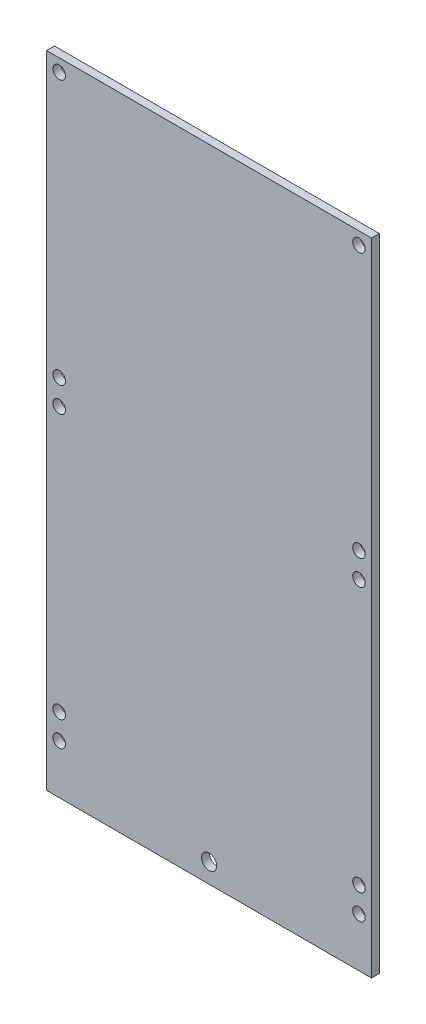
ISO-10303-21;
HEADER;
FILE_DESCRIPTION(('STEP AP214'),'2;1');
FILE_NAME('part.step','',(''),(''),'','','');
FILE_SCHEMA(('AUTOMOTIVE_DESIGN { 1 0 10303 214 1 1 1 1 }'));
ENDSEC;
DATA;
#1=APPLICATION_CONTEXT('core data for automotive mechanical design processes');
#2=APPLICATION_PROTOCOL_DEFINITION('international standard','automotive_design',2000,#1);
#3=PRODUCT_CONTEXT('',#1,'mechanical');
#4=PRODUCT('Part','Part','',(#3));
#5=PRODUCT_RELATED_PRODUCT_CATEGORY('part','',(#4));
#6=PRODUCT_DEFINITION_FORMATION('','',#4);
#7=PRODUCT_DEFINITION_CONTEXT('part definition',#1,'design');
#8=PRODUCT_DEFINITION('design','',#6,#7);
#9=PRODUCT_DEFINITION_SHAPE('','',#8);
#10=(LENGTH_UNIT() NAMED_UNIT(*) SI_UNIT(.MILLI.,.METRE.));
#11=(NAMED_UNIT(*) PLANE_ANGLE_UNIT() SI_UNIT($,.RADIAN.));
#12=(NAMED_UNIT(*) SI_UNIT($,.STERADIAN.) SOLID_ANGLE_UNIT());
#13=UNCERTAINTY_MEASURE_WITH_UNIT(LENGTH_MEASURE(1.E-05),#10,'distance_accuracy_value','');
#14=(GEOMETRIC_REPRESENTATION_CONTEXT(3) GLOBAL_UNCERTAINTY_ASSIGNED_CONTEXT((#13)) GLOBAL_UNIT_ASSIGNED_CONTEXT((#10,
#11,#12)) REPRESENTATION_CONTEXT('',''));
#15=CARTESIAN_POINT('',(0.,0.,0.));
#16=DIRECTION('',(0.,0.,1.));
#17=DIRECTION('',(1.,0.,0.));
#18=AXIS2_PLACEMENT_3D('',#15,#16,#17);
#19=CARTESIAN_POINT('',(0.,0.,2.));
#20=DIRECTION('',(1.,0.,0.));
#21=DIRECTION('',(0.,0.,-1.));
#22=AXIS2_PLACEMENT_3D('',#19,#20,#21);
#23=PLANE('',#22);
#24=DIRECTION('',(0.,-1.,0.));
#25=VECTOR('',#24,1.);
#26=CARTESIAN_POINT('',(0.,0.,2.));
#27=LINE('',#26,#25);
#28=CARTESIAN_POINT('',(0.,163.75,2.));
#29=VERTEX_POINT('',#28);
#30=CARTESIAN_POINT('',(0.,0.,2.));
#31=VERTEX_POINT('',#30);
#32=EDGE_CURVE('E87',#29,#31,#27,.T.);
#33=ORIENTED_EDGE('',*,*,#32,.F.);
#34=DIRECTION('',(0.,0.,-1.));
#35=VECTOR('',#34,1.);
#36=CARTESIAN_POINT('',(0.,163.75,2.));
#37=LINE('',#36,#35);
#38=CARTESIAN_POINT('',(0.,163.75,0.));
#39=VERTEX_POINT('',#38);
#40=EDGE_CURVE('E158',#29,#39,#37,.T.);
#41=ORIENTED_EDGE('',*,*,#40,.T.);
#42=DIRECTION('',(0.,-1.,0.));
#43=VECTOR('',#42,1.);
#44=CARTESIAN_POINT('',(0.,0.,0.));
#45=LINE('',#44,#43);
#46=CARTESIAN_POINT('',(0.,0.,0.));
#47=VERTEX_POINT('',#46);
#48=EDGE_CURVE('E78',#39,#47,#45,.T.);
#49=ORIENTED_EDGE('',*,*,#48,.T.);
#50=DIRECTION('',(0.,0.,-1.));
#51=VECTOR('',#50,1.);
#52=CARTESIAN_POINT('',(0.,0.,2.));
#53=LINE('',#52,#51);
#54=EDGE_CURVE('E40',#31,#47,#53,.T.);
#55=ORIENTED_EDGE('',*,*,#54,.F.);
#56=EDGE_LOOP('',(#33,#41,#49,#55));
#57=FACE_BOUND('',#56,.T.);
#58=ADVANCED_FACE('F33',(#57),#23,.F.);
#59=CARTESIAN_POINT('',(0.,0.,2.));
#60=DIRECTION('',(0.,1.,0.));
#61=DIRECTION('',(0.,0.,1.));
#62=AXIS2_PLACEMENT_3D('',#59,#60,#61);
#63=PLANE('',#62);
#64=DIRECTION('',(1.,0.,0.));
#65=VECTOR('',#64,1.);
#66=CARTESIAN_POINT('',(0.,0.,0.));
#67=LINE('',#66,#65);
#68=CARTESIAN_POINT('',(83.,0.,0.));
#69=VERTEX_POINT('',#68);
#70=EDGE_CURVE('E68',#47,#69,#67,.T.);
#71=ORIENTED_EDGE('',*,*,#70,.T.);
#72=DIRECTION('',(0.,0.,-1.));
#73=VECTOR('',#72,1.);
#74=CARTESIAN_POINT('',(83.,0.,2.));
#75=LINE('',#74,#73);
#76=CARTESIAN_POINT('',(83.,0.,2.));
#77=VERTEX_POINT('',#76);
#78=EDGE_CURVE('E71',#77,#69,#75,.T.);
#79=ORIENTED_EDGE('',*,*,#78,.F.);
#80=DIRECTION('',(1.,0.,0.));
#81=VECTOR('',#80,1.);
#82=CARTESIAN_POINT('',(0.,0.,2.));
#83=LINE('',#82,#81);
#84=EDGE_CURVE('E55',#31,#77,#83,.T.);
#85=ORIENTED_EDGE('',*,*,#84,.F.);
#86=ORIENTED_EDGE('',*,*,#54,.T.);
#87=EDGE_LOOP('',(#71,#79,#85,#86));
#88=FACE_BOUND('',#87,.T.);
#89=ADVANCED_FACE('F70',(#88),#63,.F.);
#90=CARTESIAN_POINT('',(83.,0.,2.));
#91=DIRECTION('',(-1.,0.,0.));
#92=DIRECTION('',(0.,0.,1.));
#93=AXIS2_PLACEMENT_3D('',#90,#91,#92);
#94=PLANE('',#93);
#95=DIRECTION('',(0.,1.,0.));
#96=VECTOR('',#95,1.);
#97=CARTESIAN_POINT('',(83.,0.,0.));
#98=LINE('',#97,#96);
#99=CARTESIAN_POINT('',(83.,163.75,0.));
#100=VERTEX_POINT('',#99);
#101=EDGE_CURVE('E77',#69,#100,#98,.T.);
#102=ORIENTED_EDGE('',*,*,#101,.T.);
#103=DIRECTION('',(0.,0.,1.));
#104=VECTOR('',#103,1.);
#105=CARTESIAN_POINT('',(83.,163.75,-8.));
#106=LINE('',#105,#104);
#107=CARTESIAN_POINT('',(83.,163.75,2.));
#108=VERTEX_POINT('',#107);
#109=EDGE_CURVE('E46',#100,#108,#106,.T.);
#110=ORIENTED_EDGE('',*,*,#109,.T.);
#111=DIRECTION('',(0.,1.,0.));
#112=VECTOR('',#111,1.);
#113=CARTESIAN_POINT('',(83.,0.,2.));
#114=LINE('',#113,#112);
#115=EDGE_CURVE('E83',#77,#108,#114,.T.);
#116=ORIENTED_EDGE('',*,*,#115,.F.);
#117=ORIENTED_EDGE('',*,*,#78,.T.);
#118=EDGE_LOOP('',(#102,#110,#116,#117));
#119=FACE_BOUND('',#118,.T.);
#120=ADVANCED_FACE('F82',(#119),#94,.F.);
#121=CARTESIAN_POINT('',(0.,0.,2.));
#122=DIRECTION('',(0.,0.,-1.));
#123=DIRECTION('',(-1.,0.,0.));
#124=AXIS2_PLACEMENT_3D('',#121,#122,#123);
#125=PLANE('',#124);
#126=CARTESIAN_POINT('',(41.5,4.97599999999998,2.));
#127=DIRECTION('',(0.,0.,1.));
#128=DIRECTION('',(1.,0.,0.));
#129=AXIS2_PLACEMENT_3D('',#126,#127,#128);
#130=CIRCLE('',#129,1.93);
#131=CARTESIAN_POINT('',(43.43,4.97599999999998,2.));
#132=VERTEX_POINT('',#131);
#133=EDGE_CURVE('E155',#132,#132,#130,.T.);
#134=ORIENTED_EDGE('',*,*,#133,.F.);
#135=EDGE_LOOP('',(#134));
#136=FACE_BOUND('',#135,.T.);
#137=CARTESIAN_POINT('',(79.8000000000031,12.5999999999999,2.));
#138=DIRECTION('',(0.,0.,1.));
#139=DIRECTION('',(1.,0.,0.));
#140=AXIS2_PLACEMENT_3D('',#137,#138,#139);
#141=CIRCLE('',#140,1.6);
#142=CARTESIAN_POINT('',(81.4000000000031,12.5999999999999,2.));
#143=VERTEX_POINT('',#142);
#144=EDGE_CURVE('E149',#143,#143,#141,.T.);
#145=ORIENTED_EDGE('',*,*,#144,.F.);
#146=EDGE_LOOP('',(#145));
#147=FACE_BOUND('',#146,.T.);
#148=CARTESIAN_POINT('',(79.8000000000031,19.,2.));
#149=DIRECTION('',(0.,0.,1.));
#150=DIRECTION('',(1.,0.,0.));
#151=AXIS2_PLACEMENT_3D('',#148,#149,#150);
#152=CIRCLE('',#151,1.6);
#153=CARTESIAN_POINT('',(81.4000000000031,19.,2.));
#154=VERTEX_POINT('',#153);
#155=EDGE_CURVE('E143',#154,#154,#152,.T.);
#156=ORIENTED_EDGE('',*,*,#155,.F.);
#157=EDGE_LOOP('',(#156));
#158=FACE_BOUND('',#157,.T.);
#159=CARTESIAN_POINT('',(3.2000000000031,12.5999999999999,2.));
#160=DIRECTION('',(0.,0.,1.));
#161=DIRECTION('',(1.,0.,0.));
#162=AXIS2_PLACEMENT_3D('',#159,#160,#161);
#163=CIRCLE('',#162,1.59999999999999);
#164=CARTESIAN_POINT('',(4.80000000000309,12.5999999999999,2.));
#165=VERTEX_POINT('',#164);
#166=EDGE_CURVE('E137',#165,#165,#163,.T.);
#167=ORIENTED_EDGE('',*,*,#166,.F.);
#168=EDGE_LOOP('',(#167));
#169=FACE_BOUND('',#168,.T.);
#170=CARTESIAN_POINT('',(3.2000000000031,19.,2.));
#171=DIRECTION('',(0.,0.,1.));
#172=DIRECTION('',(1.,0.,0.));
#173=AXIS2_PLACEMENT_3D('',#170,#171,#172);
#174=CIRCLE('',#173,1.59999999999999);
#175=CARTESIAN_POINT('',(4.80000000000309,19.,2.));
#176=VERTEX_POINT('',#175);
#177=EDGE_CURVE('E131',#176,#176,#174,.T.);
#178=ORIENTED_EDGE('',*,*,#177,.F.);
#179=EDGE_LOOP('',(#178));
#180=FACE_BOUND('',#179,.T.);
#181=CARTESIAN_POINT('',(79.8000000000023,86.575,2.));
#182=DIRECTION('',(0.,0.,1.));
#183=DIRECTION('',(1.,0.,0.));
#184=AXIS2_PLACEMENT_3D('',#181,#182,#183);
#185=CIRCLE('',#184,1.6);
#186=CARTESIAN_POINT('',(81.4000000000023,86.575,2.));
#187=VERTEX_POINT('',#186);
#188=EDGE_CURVE('E125',#187,#187,#185,.T.);
#189=ORIENTED_EDGE('',*,*,#188,.F.);
#190=EDGE_LOOP('',(#189));
#191=FACE_BOUND('',#190,.T.);
#192=CARTESIAN_POINT('',(79.8000000000023,92.975,2.));
#193=DIRECTION('',(0.,0.,1.));
#194=DIRECTION('',(1.,0.,0.));
#195=AXIS2_PLACEMENT_3D('',#192,#193,#194);
#196=CIRCLE('',#195,1.6);
#197=CARTESIAN_POINT('',(81.4000000000023,92.975,2.));
#198=VERTEX_POINT('',#197);
#199=EDGE_CURVE('E119',#198,#198,#196,.T.);
#200=ORIENTED_EDGE('',*,*,#199,.F.);
#201=EDGE_LOOP('',(#200));
#202=FACE_BOUND('',#201,.T.);
#203=CARTESIAN_POINT('',(3.20000000000232,86.575,2.));
#204=DIRECTION('',(0.,0.,1.));
#205=DIRECTION('',(1.,0.,0.));
#206=AXIS2_PLACEMENT_3D('',#203,#204,#205);
#207=CIRCLE('',#206,1.59999999999999);
#208=CARTESIAN_POINT('',(4.80000000000232,86.575,2.));
#209=VERTEX_POINT('',#208);
#210=EDGE_CURVE('E113',#209,#209,#207,.T.);
#211=ORIENTED_EDGE('',*,*,#210,.F.);
#212=EDGE_LOOP('',(#211));
#213=FACE_BOUND('',#212,.T.);
#214=CARTESIAN_POINT('',(3.20000000000232,92.975,2.));
#215=DIRECTION('',(0.,0.,1.));
#216=DIRECTION('',(1.,0.,0.));
#217=AXIS2_PLACEMENT_3D('',#214,#215,#216);
#218=CIRCLE('',#217,1.59999999999999);
#219=CARTESIAN_POINT('',(4.80000000000232,92.975,2.));
#220=VERTEX_POINT('',#219);
#221=EDGE_CURVE('E107',#220,#220,#218,.T.);
#222=ORIENTED_EDGE('',*,*,#221,.F.);
#223=EDGE_LOOP('',(#222));
#224=FACE_BOUND('',#223,.T.);
#225=CARTESIAN_POINT('',(79.8000000000015,160.55,2.));
#226=DIRECTION('',(0.,0.,1.));
#227=DIRECTION('',(1.,0.,0.));
#228=AXIS2_PLACEMENT_3D('',#225,#226,#227);
#229=CIRCLE('',#228,1.6);
#230=CARTESIAN_POINT('',(81.4000000000015,160.55,2.));
#231=VERTEX_POINT('',#230);
#232=EDGE_CURVE('E101',#231,#231,#229,.T.);
#233=ORIENTED_EDGE('',*,*,#232,.F.);
#234=EDGE_LOOP('',(#233));
#235=FACE_BOUND('',#234,.T.);
#236=CARTESIAN_POINT('',(3.20000000000155,160.55,2.));
#237=DIRECTION('',(0.,0.,1.));
#238=DIRECTION('',(1.,0.,0.));
#239=AXIS2_PLACEMENT_3D('',#236,#237,#238);
#240=CIRCLE('',#239,1.59999999999999);
#241=CARTESIAN_POINT('',(4.80000000000154,160.55,2.));
#242=VERTEX_POINT('',#241);
#243=EDGE_CURVE('E95',#242,#242,#240,.T.);
#244=ORIENTED_EDGE('',*,*,#243,.F.);
#245=EDGE_LOOP('',(#244));
#246=FACE_BOUND('',#245,.T.);
#247=ORIENTED_EDGE('',*,*,#115,.T.);
#248=DIRECTION('',(1.,0.,0.));
#249=VECTOR('',#248,1.);
#250=CARTESIAN_POINT('',(-33.4076517871154,163.75,2.));
#251=LINE('',#250,#249);
#252=EDGE_CURVE('E164',#29,#108,#251,.T.);
#253=ORIENTED_EDGE('',*,*,#252,.F.);
#254=ORIENTED_EDGE('',*,*,#32,.T.);
#255=ORIENTED_EDGE('',*,*,#84,.T.);
#256=EDGE_LOOP('',(#247,#253,#254,#255));
#257=FACE_BOUND('',#256,.T.);
#258=ADVANCED_FACE('F172',(#136,#147,#158,#169,#180,#191,#202,#213,#224,#235,#246,#257),#125,.F.);
#259=CARTESIAN_POINT('',(0.,0.,0.));
#260=DIRECTION('',(0.,0.,-1.));
#261=DIRECTION('',(-1.,0.,0.));
#262=AXIS2_PLACEMENT_3D('',#259,#260,#261);
#263=PLANE('',#262);
#264=DIRECTION('',(-1.,0.,0.));
#265=VECTOR('',#264,1.);
#266=CARTESIAN_POINT('',(0.,163.75,0.));
#267=LINE('',#266,#265);
#268=EDGE_CURVE('E11',#100,#39,#267,.T.);
#269=ORIENTED_EDGE('',*,*,#268,.F.);
#270=ORIENTED_EDGE('',*,*,#101,.F.);
#271=ORIENTED_EDGE('',*,*,#70,.F.);
#272=ORIENTED_EDGE('',*,*,#48,.F.);
#273=EDGE_LOOP('',(#269,#270,#271,#272));
#274=FACE_BOUND('',#273,.T.);
#275=CARTESIAN_POINT('',(41.5,4.97599999999998,0.));
#276=DIRECTION('',(0.,0.,1.));
#277=DIRECTION('',(1.,0.,0.));
#278=AXIS2_PLACEMENT_3D('',#275,#276,#277);
#279=CIRCLE('',#278,1.93);
#280=CARTESIAN_POINT('',(43.43,4.97599999999998,0.));
#281=VERTEX_POINT('',#280);
#282=EDGE_CURVE('E152',#281,#281,#279,.T.);
#283=ORIENTED_EDGE('',*,*,#282,.T.);
#284=EDGE_LOOP('',(#283));
#285=FACE_BOUND('',#284,.T.);
#286=CARTESIAN_POINT('',(79.8000000000031,12.5999999999999,0.));
#287=DIRECTION('',(0.,0.,1.));
#288=DIRECTION('',(1.,0.,0.));
#289=AXIS2_PLACEMENT_3D('',#286,#287,#288);
#290=CIRCLE('',#289,1.6);
#291=CARTESIAN_POINT('',(81.4000000000031,12.5999999999999,0.));
#292=VERTEX_POINT('',#291);
#293=EDGE_CURVE('E146',#292,#292,#290,.T.);
#294=ORIENTED_EDGE('',*,*,#293,.T.);
#295=EDGE_LOOP('',(#294));
#296=FACE_BOUND('',#295,.T.);
#297=CARTESIAN_POINT('',(79.8000000000031,19.,0.));
#298=DIRECTION('',(0.,0.,1.));
#299=DIRECTION('',(1.,0.,0.));
#300=AXIS2_PLACEMENT_3D('',#297,#298,#299);
#301=CIRCLE('',#300,1.6);
#302=CARTESIAN_POINT('',(81.4000000000031,19.,0.));
#303=VERTEX_POINT('',#302);
#304=EDGE_CURVE('E140',#303,#303,#301,.T.);
#305=ORIENTED_EDGE('',*,*,#304,.T.);
#306=EDGE_LOOP('',(#305));
#307=FACE_BOUND('',#306,.T.);
#308=CARTESIAN_POINT('',(3.2000000000031,12.5999999999999,0.));
#309=DIRECTION('',(0.,0.,1.));
#310=DIRECTION('',(1.,0.,0.));
#311=AXIS2_PLACEMENT_3D('',#308,#309,#310);
#312=CIRCLE('',#311,1.59999999999999);
#313=CARTESIAN_POINT('',(4.80000000000309,12.5999999999999,0.));
#314=VERTEX_POINT('',#313);
#315=EDGE_CURVE('E134',#314,#314,#312,.T.);
#316=ORIENTED_EDGE('',*,*,#315,.T.);
#317=EDGE_LOOP('',(#316));
#318=FACE_BOUND('',#317,.T.);
#319=CARTESIAN_POINT('',(3.2000000000031,19.,0.));
#320=DIRECTION('',(0.,0.,1.));
#321=DIRECTION('',(1.,0.,0.));
#322=AXIS2_PLACEMENT_3D('',#319,#320,#321);
#323=CIRCLE('',#322,1.59999999999999);
#324=CARTESIAN_POINT('',(4.80000000000309,19.,0.));
#325=VERTEX_POINT('',#324);
#326=EDGE_CURVE('E128',#325,#325,#323,.T.);
#327=ORIENTED_EDGE('',*,*,#326,.T.);
#328=EDGE_LOOP('',(#327));
#329=FACE_BOUND('',#328,.T.);
#330=CARTESIAN_POINT('',(79.8000000000023,86.575,0.));
#331=DIRECTION('',(0.,0.,1.));
#332=DIRECTION('',(1.,0.,0.));
#333=AXIS2_PLACEMENT_3D('',#330,#331,#332);
#334=CIRCLE('',#333,1.6);
#335=CARTESIAN_POINT('',(81.4000000000023,86.575,0.));
#336=VERTEX_POINT('',#335);
#337=EDGE_CURVE('E122',#336,#336,#334,.T.);
#338=ORIENTED_EDGE('',*,*,#337,.T.);
#339=EDGE_LOOP('',(#338));
#340=FACE_BOUND('',#339,.T.);
#341=CARTESIAN_POINT('',(79.8000000000023,92.975,0.));
#342=DIRECTION('',(0.,0.,1.));
#343=DIRECTION('',(1.,0.,0.));
#344=AXIS2_PLACEMENT_3D('',#341,#342,#343);
#345=CIRCLE('',#344,1.6);
#346=CARTESIAN_POINT('',(81.4000000000023,92.975,0.));
#347=VERTEX_POINT('',#346);
#348=EDGE_CURVE('E116',#347,#347,#345,.T.);
#349=ORIENTED_EDGE('',*,*,#348,.T.);
#350=EDGE_LOOP('',(#349));
#351=FACE_BOUND('',#350,.T.);
#352=CARTESIAN_POINT('',(3.20000000000232,86.575,0.));
#353=DIRECTION('',(0.,0.,1.));
#354=DIRECTION('',(1.,0.,0.));
#355=AXIS2_PLACEMENT_3D('',#352,#353,#354);
#356=CIRCLE('',#355,1.59999999999999);
#357=CARTESIAN_POINT('',(4.80000000000232,86.575,0.));
#358=VERTEX_POINT('',#357);
#359=EDGE_CURVE('E110',#358,#358,#356,.T.);
#360=ORIENTED_EDGE('',*,*,#359,.T.);
#361=EDGE_LOOP('',(#360));
#362=FACE_BOUND('',#361,.T.);
#363=CARTESIAN_POINT('',(3.20000000000232,92.975,0.));
#364=DIRECTION('',(0.,0.,1.));
#365=DIRECTION('',(1.,0.,0.));
#366=AXIS2_PLACEMENT_3D('',#363,#364,#365);
#367=CIRCLE('',#366,1.59999999999999);
#368=CARTESIAN_POINT('',(4.80000000000232,92.975,0.));
#369=VERTEX_POINT('',#368);
#370=EDGE_CURVE('E104',#369,#369,#367,.T.);
#371=ORIENTED_EDGE('',*,*,#370,.T.);
#372=EDGE_LOOP('',(#371));
#373=FACE_BOUND('',#372,.T.);
#374=CARTESIAN_POINT('',(79.8000000000015,160.55,0.));
#375=DIRECTION('',(0.,0.,1.));
#376=DIRECTION('',(1.,0.,0.));
#377=AXIS2_PLACEMENT_3D('',#374,#375,#376);
#378=CIRCLE('',#377,1.6);
#379=CARTESIAN_POINT('',(81.4000000000015,160.55,0.));
#380=VERTEX_POINT('',#379);
#381=EDGE_CURVE('E98',#380,#380,#378,.T.);
#382=ORIENTED_EDGE('',*,*,#381,.T.);
#383=EDGE_LOOP('',(#382));
#384=FACE_BOUND('',#383,.T.);
#385=CARTESIAN_POINT('',(3.20000000000155,160.55,0.));
#386=DIRECTION('',(0.,0.,1.));
#387=DIRECTION('',(1.,0.,0.));
#388=AXIS2_PLACEMENT_3D('',#385,#386,#387);
#389=CIRCLE('',#388,1.59999999999999);
#390=CARTESIAN_POINT('',(4.80000000000154,160.55,0.));
#391=VERTEX_POINT('',#390);
#392=EDGE_CURVE('E92',#391,#391,#389,.T.);
#393=ORIENTED_EDGE('',*,*,#392,.T.);
#394=EDGE_LOOP('',(#393));
#395=FACE_BOUND('',#394,.T.);
#396=ADVANCED_FACE('F85',(#274,#285,#296,#307,#318,#329,#340,#351,#362,#373,#384,#395),#263,.T.);
#397=CARTESIAN_POINT('',(3.20000000000155,160.55,0.));
#398=DIRECTION('',(0.,0.,1.));
#399=DIRECTION('',(1.,0.,0.));
#400=AXIS2_PLACEMENT_3D('',#397,#398,#399);
#401=CYLINDRICAL_SURFACE('',#400,1.59999999999999);
#402=ORIENTED_EDGE('',*,*,#392,.F.);
#403=EDGE_LOOP('',(#402));
#404=FACE_BOUND('',#403,.T.);
#405=ORIENTED_EDGE('',*,*,#243,.T.);
#406=EDGE_LOOP('',(#405));
#407=FACE_BOUND('',#406,.T.);
#408=ADVANCED_FACE('F180',(#404,#407),#401,.F.);
#409=CARTESIAN_POINT('',(79.8000000000015,160.55,0.));
#410=DIRECTION('',(0.,0.,1.));
#411=DIRECTION('',(1.,0.,0.));
#412=AXIS2_PLACEMENT_3D('',#409,#410,#411);
#413=CYLINDRICAL_SURFACE('',#412,1.6);
#414=ORIENTED_EDGE('',*,*,#381,.F.);
#415=EDGE_LOOP('',(#414));
#416=FACE_BOUND('',#415,.T.);
#417=ORIENTED_EDGE('',*,*,#232,.T.);
#418=EDGE_LOOP('',(#417));
#419=FACE_BOUND('',#418,.T.);
#420=ADVANCED_FACE('F294',(#416,#419),#413,.F.);
#421=CARTESIAN_POINT('',(3.20000000000232,92.975,0.));
#422=DIRECTION('',(0.,0.,1.));
#423=DIRECTION('',(1.,0.,0.));
#424=AXIS2_PLACEMENT_3D('',#421,#422,#423);
#425=CYLINDRICAL_SURFACE('',#424,1.59999999999999);
#426=ORIENTED_EDGE('',*,*,#370,.F.);
#427=EDGE_LOOP('',(#426));
#428=FACE_BOUND('',#427,.T.);
#429=ORIENTED_EDGE('',*,*,#221,.T.);
#430=EDGE_LOOP('',(#429));
#431=FACE_BOUND('',#430,.T.);
#432=ADVANCED_FACE('F286',(#428,#431),#425,.F.);
#433=CARTESIAN_POINT('',(3.20000000000232,86.575,0.));
#434=DIRECTION('',(0.,0.,1.));
#435=DIRECTION('',(1.,0.,0.));
#436=AXIS2_PLACEMENT_3D('',#433,#434,#435);
#437=CYLINDRICAL_SURFACE('',#436,1.59999999999999);
#438=ORIENTED_EDGE('',*,*,#359,.F.);
#439=EDGE_LOOP('',(#438));
#440=FACE_BOUND('',#439,.T.);
#441=ORIENTED_EDGE('',*,*,#210,.T.);
#442=EDGE_LOOP('',(#441));
#443=FACE_BOUND('',#442,.T.);
#444=ADVANCED_FACE('F278',(#440,#443),#437,.F.);
#445=CARTESIAN_POINT('',(79.8000000000023,92.975,0.));
#446=DIRECTION('',(0.,0.,1.));
#447=DIRECTION('',(1.,0.,0.));
#448=AXIS2_PLACEMENT_3D('',#445,#446,#447);
#449=CYLINDRICAL_SURFACE('',#448,1.6);
#450=ORIENTED_EDGE('',*,*,#348,.F.);
#451=EDGE_LOOP('',(#450));
#452=FACE_BOUND('',#451,.T.);
#453=ORIENTED_EDGE('',*,*,#199,.T.);
#454=EDGE_LOOP('',(#453));
#455=FACE_BOUND('',#454,.T.);
#456=ADVANCED_FACE('F270',(#452,#455),#449,.F.);
#457=CARTESIAN_POINT('',(79.8000000000023,86.575,0.));
#458=DIRECTION('',(0.,0.,1.));
#459=DIRECTION('',(1.,0.,0.));
#460=AXIS2_PLACEMENT_3D('',#457,#458,#459);
#461=CYLINDRICAL_SURFACE('',#460,1.6);
#462=ORIENTED_EDGE('',*,*,#337,.F.);
#463=EDGE_LOOP('',(#462));
#464=FACE_BOUND('',#463,.T.);
#465=ORIENTED_EDGE('',*,*,#188,.T.);
#466=EDGE_LOOP('',(#465));
#467=FACE_BOUND('',#466,.T.);
#468=ADVANCED_FACE('F262',(#464,#467),#461,.F.);
#469=CARTESIAN_POINT('',(3.2000000000031,19.,0.));
#470=DIRECTION('',(0.,0.,1.));
#471=DIRECTION('',(1.,0.,0.));
#472=AXIS2_PLACEMENT_3D('',#469,#470,#471);
#473=CYLINDRICAL_SURFACE('',#472,1.59999999999999);
#474=ORIENTED_EDGE('',*,*,#326,.F.);
#475=EDGE_LOOP('',(#474));
#476=FACE_BOUND('',#475,.T.);
#477=ORIENTED_EDGE('',*,*,#177,.T.);
#478=EDGE_LOOP('',(#477));
#479=FACE_BOUND('',#478,.T.);
#480=ADVANCED_FACE('F254',(#476,#479),#473,.F.);
#481=CARTESIAN_POINT('',(3.2000000000031,12.5999999999999,0.));
#482=DIRECTION('',(0.,0.,1.));
#483=DIRECTION('',(1.,0.,0.));
#484=AXIS2_PLACEMENT_3D('',#481,#482,#483);
#485=CYLINDRICAL_SURFACE('',#484,1.59999999999999);
#486=ORIENTED_EDGE('',*,*,#315,.F.);
#487=EDGE_LOOP('',(#486));
#488=FACE_BOUND('',#487,.T.);
#489=ORIENTED_EDGE('',*,*,#166,.T.);
#490=EDGE_LOOP('',(#489));
#491=FACE_BOUND('',#490,.T.);
#492=ADVANCED_FACE('F246',(#488,#491),#485,.F.);
#493=CARTESIAN_POINT('',(79.8000000000031,19.,0.));
#494=DIRECTION('',(0.,0.,1.));
#495=DIRECTION('',(1.,0.,0.));
#496=AXIS2_PLACEMENT_3D('',#493,#494,#495);
#497=CYLINDRICAL_SURFACE('',#496,1.6);
#498=ORIENTED_EDGE('',*,*,#304,.F.);
#499=EDGE_LOOP('',(#498));
#500=FACE_BOUND('',#499,.T.);
#501=ORIENTED_EDGE('',*,*,#155,.T.);
#502=EDGE_LOOP('',(#501));
#503=FACE_BOUND('',#502,.T.);
#504=ADVANCED_FACE('F238',(#500,#503),#497,.F.);
#505=CARTESIAN_POINT('',(79.8000000000031,12.5999999999999,0.));
#506=DIRECTION('',(0.,0.,1.));
#507=DIRECTION('',(1.,0.,0.));
#508=AXIS2_PLACEMENT_3D('',#505,#506,#507);
#509=CYLINDRICAL_SURFACE('',#508,1.6);
#510=ORIENTED_EDGE('',*,*,#293,.F.);
#511=EDGE_LOOP('',(#510));
#512=FACE_BOUND('',#511,.T.);
#513=ORIENTED_EDGE('',*,*,#144,.T.);
#514=EDGE_LOOP('',(#513));
#515=FACE_BOUND('',#514,.T.);
#516=ADVANCED_FACE('F231',(#512,#515),#509,.F.);
#517=CARTESIAN_POINT('',(41.5,4.97599999999998,0.));
#518=DIRECTION('',(0.,0.,1.));
#519=DIRECTION('',(1.,0.,0.));
#520=AXIS2_PLACEMENT_3D('',#517,#518,#519);
#521=CYLINDRICAL_SURFACE('',#520,1.93);
#522=ORIENTED_EDGE('',*,*,#282,.F.);
#523=EDGE_LOOP('',(#522));
#524=FACE_BOUND('',#523,.T.);
#525=ORIENTED_EDGE('',*,*,#133,.T.);
#526=EDGE_LOOP('',(#525));
#527=FACE_BOUND('',#526,.T.);
#528=ADVANCED_FACE('F222',(#524,#527),#521,.F.);
#529=CARTESIAN_POINT('',(-33.4076517871154,163.75,-8.));
#530=DIRECTION('',(0.,-1.,0.));
#531=DIRECTION('',(0.,0.,-1.));
#532=AXIS2_PLACEMENT_3D('',#529,#530,#531);
#533=PLANE('',#532);
#534=ORIENTED_EDGE('',*,*,#252,.T.);
#535=ORIENTED_EDGE('',*,*,#109,.F.);
#536=ORIENTED_EDGE('',*,*,#268,.T.);
#537=ORIENTED_EDGE('',*,*,#40,.F.);
#538=EDGE_LOOP('',(#534,#535,#536,#537));
#539=FACE_BOUND('',#538,.T.);
#540=ADVANCED_FACE('F168',(#539),#533,.F.);
#541=CLOSED_SHELL('',(#58,#89,#120,#258,#396,#408,#420,#432,#444,#456,#468,#480,#492,#504,#516,
#528,#540));
#542=MANIFOLD_SOLID_BREP('B2',#541);
#543=ADVANCED_BREP_SHAPE_REPRESENTATION('',(#18,#542),#14);
#544=SHAPE_DEFINITION_REPRESENTATION(#9,#543);
ENDSEC;
END-ISO-10303-21;
